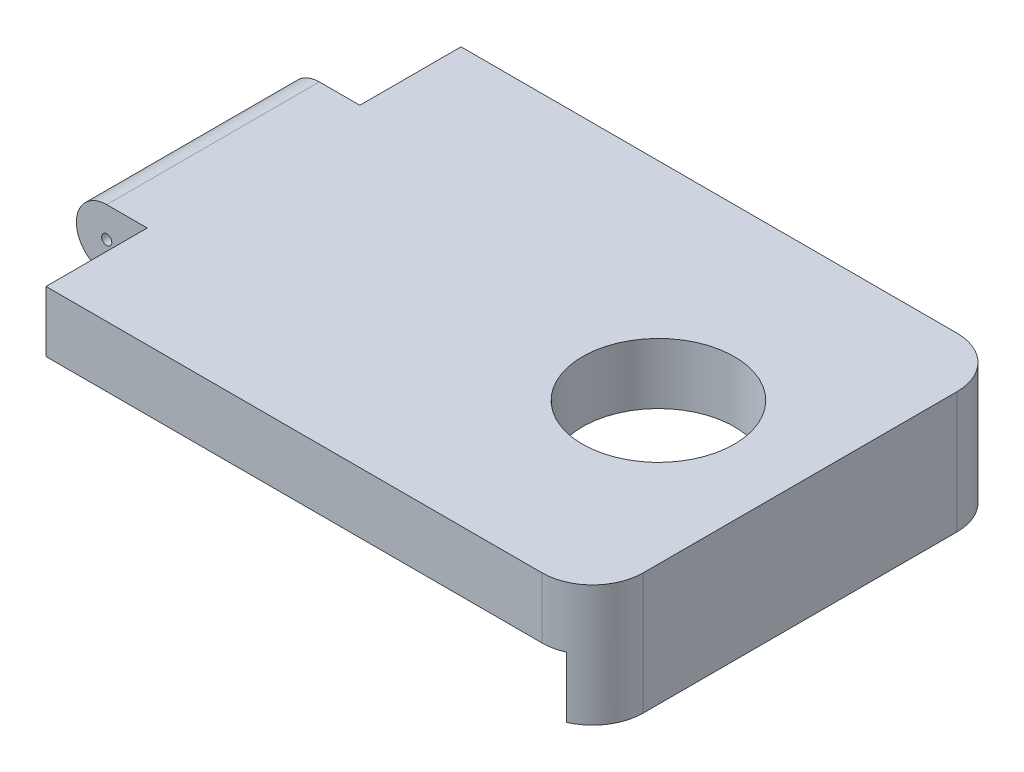
ISO-10303-21;
HEADER;
FILE_DESCRIPTION(('STEP AP214'),'2;1');
FILE_NAME('part.step','',(''),(''),'','','');
FILE_SCHEMA(('AUTOMOTIVE_DESIGN { 1 0 10303 214 1 1 1 1 }'));
ENDSEC;
DATA;
#1=APPLICATION_CONTEXT('core data for automotive mechanical design processes');
#2=APPLICATION_PROTOCOL_DEFINITION('international standard','automotive_design',2000,#1);
#3=PRODUCT_CONTEXT('',#1,'mechanical');
#4=PRODUCT('Part','Part','',(#3));
#5=PRODUCT_RELATED_PRODUCT_CATEGORY('part','',(#4));
#6=PRODUCT_DEFINITION_FORMATION('','',#4);
#7=PRODUCT_DEFINITION_CONTEXT('part definition',#1,'design');
#8=PRODUCT_DEFINITION('design','',#6,#7);
#9=PRODUCT_DEFINITION_SHAPE('','',#8);
#10=(LENGTH_UNIT() NAMED_UNIT(*) SI_UNIT(.MILLI.,.METRE.));
#11=(NAMED_UNIT(*) PLANE_ANGLE_UNIT() SI_UNIT($,.RADIAN.));
#12=(NAMED_UNIT(*) SI_UNIT($,.STERADIAN.) SOLID_ANGLE_UNIT());
#13=UNCERTAINTY_MEASURE_WITH_UNIT(LENGTH_MEASURE(1.E-05),#10,'distance_accuracy_value','');
#14=(GEOMETRIC_REPRESENTATION_CONTEXT(3) GLOBAL_UNCERTAINTY_ASSIGNED_CONTEXT((#13)) GLOBAL_UNIT_ASSIGNED_CONTEXT((#10,
#11,#12)) REPRESENTATION_CONTEXT('',''));
#15=CARTESIAN_POINT('',(0.,0.,0.));
#16=DIRECTION('',(0.,0.,1.));
#17=DIRECTION('',(1.,0.,0.));
#18=AXIS2_PLACEMENT_3D('',#15,#16,#17);
#19=CARTESIAN_POINT('',(0.,0.,0.));
#20=DIRECTION('',(0.,-1.,0.));
#21=DIRECTION('',(0.,0.,-1.));
#22=AXIS2_PLACEMENT_3D('',#19,#20,#21);
#23=PLANE('',#22);
#24=CARTESIAN_POINT('',(13.,0.,0.));
#25=DIRECTION('',(0.,1.,0.));
#26=DIRECTION('',(0.,0.,1.));
#27=AXIS2_PLACEMENT_3D('',#24,#25,#26);
#28=CIRCLE('',#27,7.5);
#29=CARTESIAN_POINT('',(13.,0.,7.5));
#30=VERTEX_POINT('',#29);
#31=EDGE_CURVE('E147',#30,#30,#28,.T.);
#32=ORIENTED_EDGE('',*,*,#31,.T.);
#33=EDGE_LOOP('',(#32));
#34=FACE_BOUND('',#33,.T.);
#35=CARTESIAN_POINT('',(22.,0.,-15.5));
#36=DIRECTION('',(0.,-1.,0.));
#37=DIRECTION('',(0.,0.,-1.));
#38=AXIS2_PLACEMENT_3D('',#35,#36,#37);
#39=CIRCLE('',#38,5.);
#40=CARTESIAN_POINT('',(22.,0.,-20.5));
#41=VERTEX_POINT('',#40);
#42=CARTESIAN_POINT('',(24.,0.,-20.0825756949558));
#43=VERTEX_POINT('',#42);
#44=EDGE_CURVE('E212',#41,#43,#39,.T.);
#45=ORIENTED_EDGE('',*,*,#44,.T.);
#46=DIRECTION('',(0.,0.,-1.));
#47=VECTOR('',#46,1.);
#48=CARTESIAN_POINT('',(24.,0.,15.5));
#49=LINE('',#48,#47);
#50=CARTESIAN_POINT('',(24.,0.,20.0825756949558));
#51=VERTEX_POINT('',#50);
#52=EDGE_CURVE('E142',#51,#43,#49,.T.);
#53=ORIENTED_EDGE('',*,*,#52,.F.);
#54=CARTESIAN_POINT('',(22.,0.,15.5));
#55=DIRECTION('',(0.,-1.,0.));
#56=DIRECTION('',(0.,0.,-1.));
#57=AXIS2_PLACEMENT_3D('',#54,#55,#56);
#58=CIRCLE('',#57,5.);
#59=CARTESIAN_POINT('',(22.,0.,20.5));
#60=VERTEX_POINT('',#59);
#61=EDGE_CURVE('E11',#51,#60,#58,.T.);
#62=ORIENTED_EDGE('',*,*,#61,.T.);
#63=DIRECTION('',(1.,0.,0.));
#64=VECTOR('',#63,1.);
#65=CARTESIAN_POINT('',(-27.,0.,20.5));
#66=LINE('',#65,#64);
#67=CARTESIAN_POINT('',(-27.,0.,20.5));
#68=VERTEX_POINT('',#67);
#69=EDGE_CURVE('E158',#68,#60,#66,.T.);
#70=ORIENTED_EDGE('',*,*,#69,.F.);
#71=DIRECTION('',(0.,0.,1.));
#72=VECTOR('',#71,1.);
#73=CARTESIAN_POINT('',(-27.,0.,10.5));
#74=LINE('',#73,#72);
#75=CARTESIAN_POINT('',(-27.,0.,10.5));
#76=VERTEX_POINT('',#75);
#77=EDGE_CURVE('E181',#76,#68,#74,.T.);
#78=ORIENTED_EDGE('',*,*,#77,.F.);
#79=DIRECTION('',(1.,0.,0.));
#80=VECTOR('',#79,1.);
#81=CARTESIAN_POINT('',(-27.,0.,10.5));
#82=LINE('',#81,#80);
#83=CARTESIAN_POINT('',(-31.,0.,10.5));
#84=VERTEX_POINT('',#83);
#85=EDGE_CURVE('E179',#84,#76,#82,.T.);
#86=ORIENTED_EDGE('',*,*,#85,.F.);
#87=DIRECTION('',(0.,0.,-1.));
#88=VECTOR('',#87,1.);
#89=CARTESIAN_POINT('',(-31.,0.,-10.5));
#90=LINE('',#89,#88);
#91=CARTESIAN_POINT('',(-31.,0.,-10.5));
#92=VERTEX_POINT('',#91);
#93=EDGE_CURVE('E199',#84,#92,#90,.T.);
#94=ORIENTED_EDGE('',*,*,#93,.T.);
#95=DIRECTION('',(-1.,0.,0.));
#96=VECTOR('',#95,1.);
#97=CARTESIAN_POINT('',(-34.,0.,-10.5));
#98=LINE('',#97,#96);
#99=CARTESIAN_POINT('',(-27.,0.,-10.5));
#100=VERTEX_POINT('',#99);
#101=EDGE_CURVE('E176',#100,#92,#98,.T.);
#102=ORIENTED_EDGE('',*,*,#101,.F.);
#103=DIRECTION('',(0.,0.,1.));
#104=VECTOR('',#103,1.);
#105=CARTESIAN_POINT('',(-27.,0.,-10.5));
#106=LINE('',#105,#104);
#107=CARTESIAN_POINT('',(-27.,0.,-20.5));
#108=VERTEX_POINT('',#107);
#109=EDGE_CURVE('E174',#108,#100,#106,.T.);
#110=ORIENTED_EDGE('',*,*,#109,.F.);
#111=DIRECTION('',(-1.,0.,0.));
#112=VECTOR('',#111,1.);
#113=CARTESIAN_POINT('',(-27.,0.,-20.5));
#114=LINE('',#113,#112);
#115=EDGE_CURVE('E153',#41,#108,#114,.T.);
#116=ORIENTED_EDGE('',*,*,#115,.F.);
#117=EDGE_LOOP('',(#45,#53,#62,#70,#78,#86,#94,#102,#110,#116));
#118=FACE_BOUND('',#117,.T.);
#119=ADVANCED_FACE('F37',(#34,#118),#23,.T.);
#120=CARTESIAN_POINT('',(22.,6.,15.5));
#121=DIRECTION('',(0.,-1.,0.));
#122=DIRECTION('',(0.,0.,-1.));
#123=AXIS2_PLACEMENT_3D('',#120,#121,#122);
#124=CYLINDRICAL_SURFACE('',#123,5.);
#125=DIRECTION('',(0.,-1.,0.));
#126=VECTOR('',#125,1.);
#127=CARTESIAN_POINT('',(27.,6.,15.5));
#128=LINE('',#127,#126);
#129=CARTESIAN_POINT('',(27.,6.,15.5));
#130=VERTEX_POINT('',#129);
#131=CARTESIAN_POINT('',(27.,-6.,15.5));
#132=VERTEX_POINT('',#131);
#133=EDGE_CURVE('E217',#130,#132,#128,.T.);
#134=ORIENTED_EDGE('',*,*,#133,.F.);
#135=CARTESIAN_POINT('',(22.,6.,15.5));
#136=DIRECTION('',(0.,-1.,0.));
#137=DIRECTION('',(0.,0.,-1.));
#138=AXIS2_PLACEMENT_3D('',#135,#136,#137);
#139=CIRCLE('',#138,5.);
#140=CARTESIAN_POINT('',(22.,6.,20.5));
#141=VERTEX_POINT('',#140);
#142=EDGE_CURVE('E45',#141,#130,#139,.F.);
#143=ORIENTED_EDGE('',*,*,#142,.F.);
#144=DIRECTION('',(0.,-1.,0.));
#145=VECTOR('',#144,1.);
#146=CARTESIAN_POINT('',(22.,6.,20.5));
#147=LINE('',#146,#145);
#148=EDGE_CURVE('E219',#60,#141,#147,.F.);
#149=ORIENTED_EDGE('',*,*,#148,.F.);
#150=ORIENTED_EDGE('',*,*,#61,.F.);
#151=DIRECTION('',(0.,1.,0.));
#152=VECTOR('',#151,1.);
#153=CARTESIAN_POINT('',(24.,-6.,20.0825756949558));
#154=LINE('',#153,#152);
#155=CARTESIAN_POINT('',(24.,-6.,20.0825756949558));
#156=VERTEX_POINT('',#155);
#157=EDGE_CURVE('E128',#156,#51,#154,.T.);
#158=ORIENTED_EDGE('',*,*,#157,.F.);
#159=CARTESIAN_POINT('',(22.,-6.,15.5));
#160=DIRECTION('',(0.,-1.,0.));
#161=DIRECTION('',(0.,0.,1.));
#162=AXIS2_PLACEMENT_3D('',#159,#160,#161);
#163=CIRCLE('',#162,4.99999999999999);
#164=EDGE_CURVE('E135',#132,#156,#163,.T.);
#165=ORIENTED_EDGE('',*,*,#164,.F.);
#166=EDGE_LOOP('',(#134,#143,#149,#150,#158,#165));
#167=FACE_BOUND('',#166,.T.);
#168=ADVANCED_FACE('F39',(#167),#124,.T.);
#169=CARTESIAN_POINT('',(22.,6.,-15.5));
#170=DIRECTION('',(0.,1.,0.));
#171=DIRECTION('',(0.,0.,1.));
#172=AXIS2_PLACEMENT_3D('',#169,#170,#171);
#173=CYLINDRICAL_SURFACE('',#172,5.);
#174=DIRECTION('',(0.,1.,0.));
#175=VECTOR('',#174,1.);
#176=CARTESIAN_POINT('',(27.,6.,-15.5));
#177=LINE('',#176,#175);
#178=CARTESIAN_POINT('',(27.,-6.,-15.5));
#179=VERTEX_POINT('',#178);
#180=CARTESIAN_POINT('',(27.,6.,-15.5));
#181=VERTEX_POINT('',#180);
#182=EDGE_CURVE('E206',#179,#181,#177,.T.);
#183=ORIENTED_EDGE('',*,*,#182,.F.);
#184=CARTESIAN_POINT('',(22.,-6.,-15.5));
#185=DIRECTION('',(0.,-1.,0.));
#186=DIRECTION('',(0.,0.,1.));
#187=AXIS2_PLACEMENT_3D('',#184,#185,#186);
#188=CIRCLE('',#187,5.00000000000002);
#189=CARTESIAN_POINT('',(24.,-6.,-20.0825756949558));
#190=VERTEX_POINT('',#189);
#191=EDGE_CURVE('E134',#190,#179,#188,.T.);
#192=ORIENTED_EDGE('',*,*,#191,.F.);
#193=DIRECTION('',(0.,1.,0.));
#194=VECTOR('',#193,1.);
#195=CARTESIAN_POINT('',(24.,-6.,-20.0825756949558));
#196=LINE('',#195,#194);
#197=EDGE_CURVE('E130',#190,#43,#196,.T.);
#198=ORIENTED_EDGE('',*,*,#197,.T.);
#199=ORIENTED_EDGE('',*,*,#44,.F.);
#200=DIRECTION('',(0.,1.,0.));
#201=VECTOR('',#200,1.);
#202=CARTESIAN_POINT('',(22.,6.,-20.5));
#203=LINE('',#202,#201);
#204=CARTESIAN_POINT('',(22.,6.,-20.5));
#205=VERTEX_POINT('',#204);
#206=EDGE_CURVE('E209',#205,#41,#203,.F.);
#207=ORIENTED_EDGE('',*,*,#206,.F.);
#208=CARTESIAN_POINT('',(22.,6.,-15.5));
#209=DIRECTION('',(0.,-1.,0.));
#210=DIRECTION('',(0.,0.,-1.));
#211=AXIS2_PLACEMENT_3D('',#208,#209,#210);
#212=CIRCLE('',#211,5.);
#213=EDGE_CURVE('E215',#181,#205,#212,.F.);
#214=ORIENTED_EDGE('',*,*,#213,.F.);
#215=EDGE_LOOP('',(#183,#192,#198,#199,#207,#214));
#216=FACE_BOUND('',#215,.T.);
#217=ADVANCED_FACE('F228',(#216),#173,.T.);
#218=CARTESIAN_POINT('',(-31.,3.,-10.5));
#219=DIRECTION('',(0.,0.,1.));
#220=DIRECTION('',(1.,0.,0.));
#221=AXIS2_PLACEMENT_3D('',#218,#219,#220);
#222=CYLINDRICAL_SURFACE('',#221,3.);
#223=DIRECTION('',(0.,0.,1.));
#224=VECTOR('',#223,1.);
#225=CARTESIAN_POINT('',(-31.,6.,0.));
#226=LINE('',#225,#224);
#227=CARTESIAN_POINT('',(-31.,6.,-10.5));
#228=VERTEX_POINT('',#227);
#229=CARTESIAN_POINT('',(-31.,6.,10.5));
#230=VERTEX_POINT('',#229);
#231=EDGE_CURVE('E196',#228,#230,#226,.T.);
#232=ORIENTED_EDGE('',*,*,#231,.F.);
#233=CARTESIAN_POINT('',(-31.,3.,-10.5));
#234=DIRECTION('',(0.,0.,1.));
#235=DIRECTION('',(1.,0.,0.));
#236=AXIS2_PLACEMENT_3D('',#233,#234,#235);
#237=CIRCLE('',#236,3.);
#238=EDGE_CURVE('E202',#92,#228,#237,.F.);
#239=ORIENTED_EDGE('',*,*,#238,.F.);
#240=ORIENTED_EDGE('',*,*,#93,.F.);
#241=CARTESIAN_POINT('',(-31.,3.,10.5));
#242=DIRECTION('',(0.,0.,-1.));
#243=DIRECTION('',(-1.,0.,0.));
#244=AXIS2_PLACEMENT_3D('',#241,#242,#243);
#245=CIRCLE('',#244,3.);
#246=EDGE_CURVE('E204',#230,#84,#245,.F.);
#247=ORIENTED_EDGE('',*,*,#246,.F.);
#248=EDGE_LOOP('',(#232,#239,#240,#247));
#249=FACE_BOUND('',#248,.T.);
#250=ADVANCED_FACE('F258',(#249),#222,.T.);
#251=CARTESIAN_POINT('',(27.,6.,20.5));
#252=DIRECTION('',(-1.,0.,0.));
#253=DIRECTION('',(0.,0.,1.));
#254=AXIS2_PLACEMENT_3D('',#251,#252,#253);
#255=PLANE('',#254);
#256=DIRECTION('',(0.,0.,-1.));
#257=VECTOR('',#256,1.);
#258=CARTESIAN_POINT('',(27.,6.,20.5));
#259=LINE('',#258,#257);
#260=EDGE_CURVE('E155',#130,#181,#259,.T.);
#261=ORIENTED_EDGE('',*,*,#260,.F.);
#262=ORIENTED_EDGE('',*,*,#133,.T.);
#263=DIRECTION('',(0.,0.,1.));
#264=VECTOR('',#263,1.);
#265=CARTESIAN_POINT('',(27.,-6.,15.5));
#266=LINE('',#265,#264);
#267=EDGE_CURVE('E141',#179,#132,#266,.T.);
#268=ORIENTED_EDGE('',*,*,#267,.F.);
#269=ORIENTED_EDGE('',*,*,#182,.T.);
#270=EDGE_LOOP('',(#261,#262,#268,#269));
#271=FACE_BOUND('',#270,.T.);
#272=ADVANCED_FACE('F226',(#271),#255,.F.);
#273=CARTESIAN_POINT('',(-27.,6.,-20.5));
#274=DIRECTION('',(0.,0.,1.));
#275=DIRECTION('',(1.,0.,0.));
#276=AXIS2_PLACEMENT_3D('',#273,#274,#275);
#277=PLANE('',#276);
#278=DIRECTION('',(-1.,0.,0.));
#279=VECTOR('',#278,1.);
#280=CARTESIAN_POINT('',(-27.,6.,-20.5));
#281=LINE('',#280,#279);
#282=CARTESIAN_POINT('',(-27.,6.,-20.5));
#283=VERTEX_POINT('',#282);
#284=EDGE_CURVE('E157',#205,#283,#281,.T.);
#285=ORIENTED_EDGE('',*,*,#284,.F.);
#286=ORIENTED_EDGE('',*,*,#206,.T.);
#287=ORIENTED_EDGE('',*,*,#115,.T.);
#288=DIRECTION('',(0.,-1.,0.));
#289=VECTOR('',#288,1.);
#290=CARTESIAN_POINT('',(-27.,6.,-20.5));
#291=LINE('',#290,#289);
#292=EDGE_CURVE('E193',#283,#108,#291,.T.);
#293=ORIENTED_EDGE('',*,*,#292,.F.);
#294=EDGE_LOOP('',(#285,#286,#287,#293));
#295=FACE_BOUND('',#294,.T.);
#296=ADVANCED_FACE('F343',(#295),#277,.F.);
#297=CARTESIAN_POINT('',(-27.,6.,-10.5));
#298=DIRECTION('',(1.,0.,0.));
#299=DIRECTION('',(0.,0.,-1.));
#300=AXIS2_PLACEMENT_3D('',#297,#298,#299);
#301=PLANE('',#300);
#302=ORIENTED_EDGE('',*,*,#109,.T.);
#303=DIRECTION('',(0.,-1.,0.));
#304=VECTOR('',#303,1.);
#305=CARTESIAN_POINT('',(-27.,6.,-10.5));
#306=LINE('',#305,#304);
#307=CARTESIAN_POINT('',(-27.,6.,-10.5));
#308=VERTEX_POINT('',#307);
#309=EDGE_CURVE('E190',#308,#100,#306,.T.);
#310=ORIENTED_EDGE('',*,*,#309,.F.);
#311=DIRECTION('',(0.,0.,1.));
#312=VECTOR('',#311,1.);
#313=CARTESIAN_POINT('',(-27.,6.,-10.5));
#314=LINE('',#313,#312);
#315=EDGE_CURVE('E160',#283,#308,#314,.T.);
#316=ORIENTED_EDGE('',*,*,#315,.F.);
#317=ORIENTED_EDGE('',*,*,#292,.T.);
#318=EDGE_LOOP('',(#302,#310,#316,#317));
#319=FACE_BOUND('',#318,.T.);
#320=ADVANCED_FACE('F354',(#319),#301,.F.);
#321=CARTESIAN_POINT('',(-34.,6.,-10.5));
#322=DIRECTION('',(0.,0.,1.));
#323=DIRECTION('',(1.,0.,0.));
#324=AXIS2_PLACEMENT_3D('',#321,#322,#323);
#325=PLANE('',#324);
#326=CARTESIAN_POINT('',(-31.,3.,-10.5));
#327=DIRECTION('',(0.,0.,1.));
#328=DIRECTION('',(1.,0.,0.));
#329=AXIS2_PLACEMENT_3D('',#326,#327,#328);
#330=CIRCLE('',#329,0.500000000000003);
#331=CARTESIAN_POINT('',(-30.5,3.,-10.5));
#332=VERTEX_POINT('',#331);
#333=EDGE_CURVE('E232',#332,#332,#330,.F.);
#334=ORIENTED_EDGE('',*,*,#333,.F.);
#335=EDGE_LOOP('',(#334));
#336=FACE_BOUND('',#335,.T.);
#337=ORIENTED_EDGE('',*,*,#101,.T.);
#338=ORIENTED_EDGE('',*,*,#238,.T.);
#339=DIRECTION('',(-1.,0.,0.));
#340=VECTOR('',#339,1.);
#341=CARTESIAN_POINT('',(-34.,6.,-10.5));
#342=LINE('',#341,#340);
#343=EDGE_CURVE('E162',#308,#228,#342,.T.);
#344=ORIENTED_EDGE('',*,*,#343,.F.);
#345=ORIENTED_EDGE('',*,*,#309,.T.);
#346=EDGE_LOOP('',(#337,#338,#344,#345));
#347=FACE_BOUND('',#346,.T.);
#348=ADVANCED_FACE('F248',(#336,#347),#325,.F.);
#349=CARTESIAN_POINT('',(-27.,6.,10.5));
#350=DIRECTION('',(0.,0.,-1.));
#351=DIRECTION('',(-1.,0.,0.));
#352=AXIS2_PLACEMENT_3D('',#349,#350,#351);
#353=PLANE('',#352);
#354=CARTESIAN_POINT('',(-31.,3.,10.5));
#355=DIRECTION('',(0.,0.,1.));
#356=DIRECTION('',(1.,0.,0.));
#357=AXIS2_PLACEMENT_3D('',#354,#355,#356);
#358=CIRCLE('',#357,0.500000000000003);
#359=CARTESIAN_POINT('',(-30.5,3.,10.5));
#360=VERTEX_POINT('',#359);
#361=EDGE_CURVE('E234',#360,#360,#358,.T.);
#362=ORIENTED_EDGE('',*,*,#361,.F.);
#363=EDGE_LOOP('',(#362));
#364=FACE_BOUND('',#363,.T.);
#365=DIRECTION('',(1.,0.,0.));
#366=VECTOR('',#365,1.);
#367=CARTESIAN_POINT('',(-27.,6.,10.5));
#368=LINE('',#367,#366);
#369=CARTESIAN_POINT('',(-27.,6.,10.5));
#370=VERTEX_POINT('',#369);
#371=EDGE_CURVE('E165',#230,#370,#368,.T.);
#372=ORIENTED_EDGE('',*,*,#371,.F.);
#373=ORIENTED_EDGE('',*,*,#246,.T.);
#374=ORIENTED_EDGE('',*,*,#85,.T.);
#375=DIRECTION('',(0.,-1.,0.));
#376=VECTOR('',#375,1.);
#377=CARTESIAN_POINT('',(-27.,6.,10.5));
#378=LINE('',#377,#376);
#379=EDGE_CURVE('E187',#370,#76,#378,.T.);
#380=ORIENTED_EDGE('',*,*,#379,.F.);
#381=EDGE_LOOP('',(#372,#373,#374,#380));
#382=FACE_BOUND('',#381,.T.);
#383=ADVANCED_FACE('F244',(#364,#382),#353,.F.);
#384=CARTESIAN_POINT('',(-27.,6.,10.5));
#385=DIRECTION('',(1.,0.,0.));
#386=DIRECTION('',(0.,0.,-1.));
#387=AXIS2_PLACEMENT_3D('',#384,#385,#386);
#388=PLANE('',#387);
#389=ORIENTED_EDGE('',*,*,#77,.T.);
#390=DIRECTION('',(0.,-1.,0.));
#391=VECTOR('',#390,1.);
#392=CARTESIAN_POINT('',(-27.,6.,20.5));
#393=LINE('',#392,#391);
#394=CARTESIAN_POINT('',(-27.,6.,20.5));
#395=VERTEX_POINT('',#394);
#396=EDGE_CURVE('E172',#395,#68,#393,.T.);
#397=ORIENTED_EDGE('',*,*,#396,.F.);
#398=DIRECTION('',(0.,0.,1.));
#399=VECTOR('',#398,1.);
#400=CARTESIAN_POINT('',(-27.,6.,10.5));
#401=LINE('',#400,#399);
#402=EDGE_CURVE('E167',#370,#395,#401,.T.);
#403=ORIENTED_EDGE('',*,*,#402,.F.);
#404=ORIENTED_EDGE('',*,*,#379,.T.);
#405=EDGE_LOOP('',(#389,#397,#403,#404));
#406=FACE_BOUND('',#405,.T.);
#407=ADVANCED_FACE('F247',(#406),#388,.F.);
#408=CARTESIAN_POINT('',(-27.,6.,20.5));
#409=DIRECTION('',(0.,0.,-1.));
#410=DIRECTION('',(-1.,0.,0.));
#411=AXIS2_PLACEMENT_3D('',#408,#409,#410);
#412=PLANE('',#411);
#413=ORIENTED_EDGE('',*,*,#69,.T.);
#414=ORIENTED_EDGE('',*,*,#148,.T.);
#415=DIRECTION('',(1.,0.,0.));
#416=VECTOR('',#415,1.);
#417=CARTESIAN_POINT('',(-27.,6.,20.5));
#418=LINE('',#417,#416);
#419=EDGE_CURVE('E169',#395,#141,#418,.T.);
#420=ORIENTED_EDGE('',*,*,#419,.F.);
#421=ORIENTED_EDGE('',*,*,#396,.T.);
#422=EDGE_LOOP('',(#413,#414,#420,#421));
#423=FACE_BOUND('',#422,.T.);
#424=ADVANCED_FACE('F264',(#423),#412,.F.);
#425=CARTESIAN_POINT('',(0.,6.,0.));
#426=DIRECTION('',(0.,-1.,0.));
#427=DIRECTION('',(0.,0.,-1.));
#428=AXIS2_PLACEMENT_3D('',#425,#426,#427);
#429=PLANE('',#428);
#430=CARTESIAN_POINT('',(13.,6.,0.));
#431=DIRECTION('',(0.,1.,0.));
#432=DIRECTION('',(0.,0.,1.));
#433=AXIS2_PLACEMENT_3D('',#430,#431,#432);
#434=CIRCLE('',#433,7.5);
#435=CARTESIAN_POINT('',(13.,6.,7.5));
#436=VERTEX_POINT('',#435);
#437=EDGE_CURVE('E144',#436,#436,#434,.T.);
#438=ORIENTED_EDGE('',*,*,#437,.F.);
#439=EDGE_LOOP('',(#438));
#440=FACE_BOUND('',#439,.T.);
#441=ORIENTED_EDGE('',*,*,#419,.T.);
#442=ORIENTED_EDGE('',*,*,#142,.T.);
#443=ORIENTED_EDGE('',*,*,#260,.T.);
#444=ORIENTED_EDGE('',*,*,#213,.T.);
#445=ORIENTED_EDGE('',*,*,#284,.T.);
#446=ORIENTED_EDGE('',*,*,#315,.T.);
#447=ORIENTED_EDGE('',*,*,#343,.T.);
#448=ORIENTED_EDGE('',*,*,#231,.T.);
#449=ORIENTED_EDGE('',*,*,#371,.T.);
#450=ORIENTED_EDGE('',*,*,#402,.T.);
#451=EDGE_LOOP('',(#441,#442,#443,#444,#445,#446,#447,#448,#449,#450));
#452=FACE_BOUND('',#451,.T.);
#453=ADVANCED_FACE('F221',(#440,#452),#429,.F.);
#454=CARTESIAN_POINT('',(13.,0.,0.));
#455=DIRECTION('',(0.,1.,0.));
#456=DIRECTION('',(0.,0.,1.));
#457=AXIS2_PLACEMENT_3D('',#454,#455,#456);
#458=CYLINDRICAL_SURFACE('',#457,7.5);
#459=ORIENTED_EDGE('',*,*,#31,.F.);
#460=EDGE_LOOP('',(#459));
#461=FACE_BOUND('',#460,.T.);
#462=ORIENTED_EDGE('',*,*,#437,.T.);
#463=EDGE_LOOP('',(#462));
#464=FACE_BOUND('',#463,.T.);
#465=ADVANCED_FACE('F271',(#461,#464),#458,.F.);
#466=CARTESIAN_POINT('',(24.,-6.,15.5));
#467=DIRECTION('',(1.,0.,0.));
#468=DIRECTION('',(0.,0.,-1.));
#469=AXIS2_PLACEMENT_3D('',#466,#467,#468);
#470=PLANE('',#469);
#471=ORIENTED_EDGE('',*,*,#52,.T.);
#472=ORIENTED_EDGE('',*,*,#197,.F.);
#473=DIRECTION('',(0.,0.,-1.));
#474=VECTOR('',#473,1.);
#475=CARTESIAN_POINT('',(24.,-6.,15.5));
#476=LINE('',#475,#474);
#477=EDGE_CURVE('E124',#156,#190,#476,.T.);
#478=ORIENTED_EDGE('',*,*,#477,.F.);
#479=ORIENTED_EDGE('',*,*,#157,.T.);
#480=EDGE_LOOP('',(#471,#472,#478,#479));
#481=FACE_BOUND('',#480,.T.);
#482=ADVANCED_FACE('F126',(#481),#470,.F.);
#483=CARTESIAN_POINT('',(22.,-6.,15.5));
#484=DIRECTION('',(0.,1.,0.));
#485=DIRECTION('',(0.,0.,1.));
#486=AXIS2_PLACEMENT_3D('',#483,#484,#485);
#487=PLANE('',#486);
#488=ORIENTED_EDGE('',*,*,#164,.T.);
#489=ORIENTED_EDGE('',*,*,#477,.T.);
#490=ORIENTED_EDGE('',*,*,#191,.T.);
#491=ORIENTED_EDGE('',*,*,#267,.T.);
#492=EDGE_LOOP('',(#488,#489,#490,#491));
#493=FACE_BOUND('',#492,.T.);
#494=ADVANCED_FACE('F139',(#493),#487,.F.);
#495=CARTESIAN_POINT('',(-31.,3.,-11.9142135623731));
#496=DIRECTION('',(0.,0.,1.));
#497=DIRECTION('',(1.,0.,0.));
#498=AXIS2_PLACEMENT_3D('',#495,#496,#497);
#499=CYLINDRICAL_SURFACE('',#498,0.500000000000003);
#500=ORIENTED_EDGE('',*,*,#333,.T.);
#501=EDGE_LOOP('',(#500));
#502=FACE_BOUND('',#501,.T.);
#503=ORIENTED_EDGE('',*,*,#361,.T.);
#504=EDGE_LOOP('',(#503));
#505=FACE_BOUND('',#504,.T.);
#506=ADVANCED_FACE('F242',(#502,#505),#499,.F.);
#507=CLOSED_SHELL('',(#119,#168,#217,#250,#272,#296,#320,#348,#383,#407,#424,#453,#465,#482,
#494,#506));
#508=MANIFOLD_SOLID_BREP('B2',#507);
#509=ADVANCED_BREP_SHAPE_REPRESENTATION('',(#18,#508),#14);
#510=SHAPE_DEFINITION_REPRESENTATION(#9,#509);
ENDSEC;
END-ISO-10303-21;
